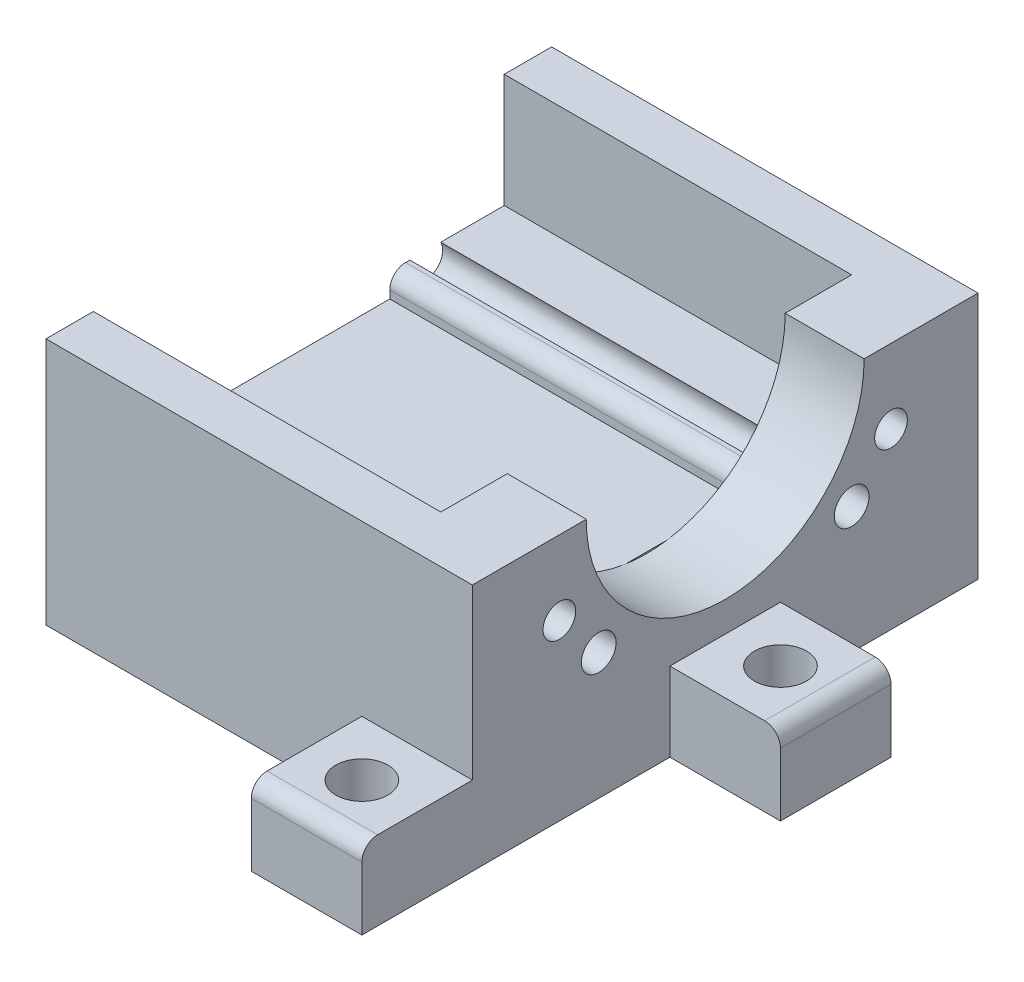
ISO-10303-21;
HEADER;
FILE_DESCRIPTION(('STEP AP214'),'2;1');
FILE_NAME('part.step','',(''),(''),'','','');
FILE_SCHEMA(('AUTOMOTIVE_DESIGN { 1 0 10303 214 1 1 1 1 }'));
ENDSEC;
DATA;
#1=APPLICATION_CONTEXT('core data for automotive mechanical design processes');
#2=APPLICATION_PROTOCOL_DEFINITION('international standard','automotive_design',2000,#1);
#3=PRODUCT_CONTEXT('',#1,'mechanical');
#4=PRODUCT('Part','Part','',(#3));
#5=PRODUCT_RELATED_PRODUCT_CATEGORY('part','',(#4));
#6=PRODUCT_DEFINITION_FORMATION('','',#4);
#7=PRODUCT_DEFINITION_CONTEXT('part definition',#1,'design');
#8=PRODUCT_DEFINITION('design','',#6,#7);
#9=PRODUCT_DEFINITION_SHAPE('','',#8);
#10=(LENGTH_UNIT() NAMED_UNIT(*) SI_UNIT(.MILLI.,.METRE.));
#11=(NAMED_UNIT(*) PLANE_ANGLE_UNIT() SI_UNIT($,.RADIAN.));
#12=(NAMED_UNIT(*) SI_UNIT($,.STERADIAN.) SOLID_ANGLE_UNIT());
#13=UNCERTAINTY_MEASURE_WITH_UNIT(LENGTH_MEASURE(1.E-05),#10,'distance_accuracy_value','');
#14=(GEOMETRIC_REPRESENTATION_CONTEXT(3) GLOBAL_UNCERTAINTY_ASSIGNED_CONTEXT((#13)) GLOBAL_UNIT_ASSIGNED_CONTEXT((#10,
#11,#12)) REPRESENTATION_CONTEXT('',''));
#15=CARTESIAN_POINT('',(0.,0.,0.));
#16=DIRECTION('',(0.,0.,1.));
#17=DIRECTION('',(1.,0.,0.));
#18=AXIS2_PLACEMENT_3D('',#15,#16,#17);
#19=CARTESIAN_POINT('',(11.,8.5,-13.0089));
#20=DIRECTION('',(0.,-1.,0.));
#21=DIRECTION('',(0.,0.,-1.));
#22=AXIS2_PLACEMENT_3D('',#19,#20,#21);
#23=PLANE('',#22);
#24=DIRECTION('',(0.,0.,1.));
#25=VECTOR('',#24,1.);
#26=CARTESIAN_POINT('',(-11.,8.5,-13.0089));
#27=LINE('',#26,#25);
#28=CARTESIAN_POINT('',(-11.,8.5,-13.0089));
#29=VERTEX_POINT('',#28);
#30=CARTESIAN_POINT('',(-11.,8.5,-8.98869589711327));
#31=VERTEX_POINT('',#30);
#32=EDGE_CURVE('E410',#29,#31,#27,.T.);
#33=ORIENTED_EDGE('',*,*,#32,.T.);
#34=DIRECTION('',(1.,0.,0.));
#35=VECTOR('',#34,1.);
#36=CARTESIAN_POINT('',(-11.,8.5,-8.98869589711327));
#37=LINE('',#36,#35);
#38=CARTESIAN_POINT('',(11.,8.5,-8.98869589711327));
#39=VERTEX_POINT('',#38);
#40=EDGE_CURVE('E317',#31,#39,#37,.T.);
#41=ORIENTED_EDGE('',*,*,#40,.T.);
#42=DIRECTION('',(0.,0.,1.));
#43=VECTOR('',#42,1.);
#44=CARTESIAN_POINT('',(11.,8.5,-13.0089));
#45=LINE('',#44,#43);
#46=CARTESIAN_POINT('',(11.,8.5,-13.0089));
#47=VERTEX_POINT('',#46);
#48=EDGE_CURVE('E390',#47,#39,#45,.T.);
#49=ORIENTED_EDGE('',*,*,#48,.F.);
#50=DIRECTION('',(-1.,0.,0.));
#51=VECTOR('',#50,1.);
#52=CARTESIAN_POINT('',(11.,8.5,-13.0089));
#53=LINE('',#52,#51);
#54=EDGE_CURVE('E431',#47,#29,#53,.T.);
#55=ORIENTED_EDGE('',*,*,#54,.T.);
#56=EDGE_LOOP('',(#33,#41,#49,#55));
#57=FACE_BOUND('',#56,.T.);
#58=ADVANCED_FACE('F35',(#57),#23,.F.);
#59=CARTESIAN_POINT('',(11.,8.5,5.7589));
#60=DIRECTION('',(0.,-1.,0.));
#61=DIRECTION('',(0.,0.,-1.));
#62=AXIS2_PLACEMENT_3D('',#59,#60,#61);
#63=PLANE('',#62);
#64=DIRECTION('',(0.,0.,1.));
#65=VECTOR('',#64,1.);
#66=CARTESIAN_POINT('',(11.,8.5,5.7589));
#67=LINE('',#66,#65);
#68=CARTESIAN_POINT('',(11.,8.5,6.7589));
#69=VERTEX_POINT('',#68);
#70=CARTESIAN_POINT('',(11.,8.5,7.02910410288673));
#71=VERTEX_POINT('',#70);
#72=EDGE_CURVE('E405',#69,#71,#67,.T.);
#73=ORIENTED_EDGE('',*,*,#72,.F.);
#74=DIRECTION('',(-1.,0.,0.));
#75=VECTOR('',#74,1.);
#76=CARTESIAN_POINT('',(11.,8.5,6.7589));
#77=LINE('',#76,#75);
#78=CARTESIAN_POINT('',(-11.,8.5,6.7589));
#79=VERTEX_POINT('',#78);
#80=EDGE_CURVE('E448',#69,#79,#77,.T.);
#81=ORIENTED_EDGE('',*,*,#80,.T.);
#82=DIRECTION('',(0.,0.,1.));
#83=VECTOR('',#82,1.);
#84=CARTESIAN_POINT('',(-11.,8.5,5.7589));
#85=LINE('',#84,#83);
#86=CARTESIAN_POINT('',(-11.,8.5,7.02910410288673));
#87=VERTEX_POINT('',#86);
#88=EDGE_CURVE('E421',#79,#87,#85,.T.);
#89=ORIENTED_EDGE('',*,*,#88,.T.);
#90=DIRECTION('',(1.,0.,0.));
#91=VECTOR('',#90,1.);
#92=CARTESIAN_POINT('',(-11.,8.5,7.02910410288673));
#93=LINE('',#92,#91);
#94=EDGE_CURVE('E304',#87,#71,#93,.T.);
#95=ORIENTED_EDGE('',*,*,#94,.T.);
#96=EDGE_LOOP('',(#73,#81,#89,#95));
#97=FACE_BOUND('',#96,.T.);
#98=ADVANCED_FACE('F479',(#97),#63,.F.);
#99=CARTESIAN_POINT('',(11.,0.,0.));
#100=DIRECTION('',(1.,0.,0.));
#101=DIRECTION('',(0.,0.,-1.));
#102=AXIS2_PLACEMENT_3D('',#99,#100,#101);
#103=PLANE('',#102);
#104=CARTESIAN_POINT('',(11.,15.7,0.));
#105=DIRECTION('',(-1.,0.,0.));
#106=DIRECTION('',(0.,0.,-1.));
#107=AXIS2_PLACEMENT_3D('',#104,#105,#106);
#108=CIRCLE('',#107,8.8);
#109=CARTESIAN_POINT('',(11.,7.,-1.32287565553229));
#110=VERTEX_POINT('',#109);
#111=CARTESIAN_POINT('',(11.,7.,1.32287565553229));
#112=VERTEX_POINT('',#111);
#113=EDGE_CURVE('E344',#110,#112,#108,.T.);
#114=ORIENTED_EDGE('',*,*,#113,.F.);
#115=DIRECTION('',(0.,0.,1.));
#116=VECTOR('',#115,1.);
#117=CARTESIAN_POINT('',(11.,7.,-5.7589));
#118=LINE('',#117,#116);
#119=EDGE_CURVE('E401',#110,#112,#118,.T.);
#120=ORIENTED_EDGE('',*,*,#119,.T.);
#121=EDGE_LOOP('',(#114,#120));
#122=FACE_BOUND('',#121,.T.);
#123=ADVANCED_FACE('F560',(#122),#103,.T.);
#124=CARTESIAN_POINT('',(11.,0.,13.0089));
#125=DIRECTION('',(0.,1.,0.));
#126=DIRECTION('',(0.,0.,1.));
#127=AXIS2_PLACEMENT_3D('',#124,#125,#126);
#128=PLANE('',#127);
#129=CARTESIAN_POINT('',(19.5,0.,0.));
#130=DIRECTION('',(0.,1.,0.));
#131=DIRECTION('',(0.,0.,1.));
#132=AXIS2_PLACEMENT_3D('',#129,#130,#131);
#133=CIRCLE('',#132,1.65);
#134=CARTESIAN_POINT('',(19.5,0.,1.65));
#135=VERTEX_POINT('',#134);
#136=EDGE_CURVE('E668',#135,#135,#133,.T.);
#137=ORIENTED_EDGE('',*,*,#136,.T.);
#138=EDGE_LOOP('',(#137));
#139=FACE_BOUND('',#138,.T.);
#140=CARTESIAN_POINT('',(12.5,0.,19.5089));
#141=DIRECTION('',(0.,1.,0.));
#142=DIRECTION('',(0.,0.,1.));
#143=AXIS2_PLACEMENT_3D('',#140,#141,#142);
#144=CIRCLE('',#143,1.65);
#145=CARTESIAN_POINT('',(12.5,0.,21.1589));
#146=VERTEX_POINT('',#145);
#147=EDGE_CURVE('E672',#146,#146,#144,.T.);
#148=ORIENTED_EDGE('',*,*,#147,.T.);
#149=EDGE_LOOP('',(#148));
#150=FACE_BOUND('',#149,.T.);
#151=DIRECTION('',(0.,0.,-1.));
#152=VECTOR('',#151,1.);
#153=CARTESIAN_POINT('',(-11.,0.,13.0089));
#154=LINE('',#153,#152);
#155=CARTESIAN_POINT('',(-11.,0.,16.0089));
#156=VERTEX_POINT('',#155);
#157=CARTESIAN_POINT('',(-11.,0.,-16.0089));
#158=VERTEX_POINT('',#157);
#159=EDGE_CURVE('E384',#156,#158,#154,.T.);
#160=ORIENTED_EDGE('',*,*,#159,.T.);
#161=DIRECTION('',(1.,0.,0.));
#162=VECTOR('',#161,1.);
#163=CARTESIAN_POINT('',(-11.,0.,-16.0089));
#164=LINE('',#163,#162);
#165=CARTESIAN_POINT('',(16.,0.,-16.0089));
#166=VERTEX_POINT('',#165);
#167=EDGE_CURVE('E365',#158,#166,#164,.T.);
#168=ORIENTED_EDGE('',*,*,#167,.T.);
#169=DIRECTION('',(0.,0.,-1.));
#170=VECTOR('',#169,1.);
#171=CARTESIAN_POINT('',(16.,0.,16.0089));
#172=LINE('',#171,#170);
#173=CARTESIAN_POINT('',(16.,0.,-3.5));
#174=VERTEX_POINT('',#173);
#175=EDGE_CURVE('E330',#174,#166,#172,.T.);
#176=ORIENTED_EDGE('',*,*,#175,.F.);
#177=DIRECTION('',(1.,0.,0.));
#178=VECTOR('',#177,1.);
#179=CARTESIAN_POINT('',(16.,0.,-3.5));
#180=LINE('',#179,#178);
#181=CARTESIAN_POINT('',(23.,0.,-3.5));
#182=VERTEX_POINT('',#181);
#183=EDGE_CURVE('E249',#174,#182,#180,.T.);
#184=ORIENTED_EDGE('',*,*,#183,.T.);
#185=DIRECTION('',(0.,0.,1.));
#186=VECTOR('',#185,1.);
#187=CARTESIAN_POINT('',(23.,0.,3.5));
#188=LINE('',#187,#186);
#189=CARTESIAN_POINT('',(23.,0.,3.5));
#190=VERTEX_POINT('',#189);
#191=EDGE_CURVE('E253',#182,#190,#188,.T.);
#192=ORIENTED_EDGE('',*,*,#191,.T.);
#193=DIRECTION('',(-1.,0.,0.));
#194=VECTOR('',#193,1.);
#195=CARTESIAN_POINT('',(16.,0.,3.5));
#196=LINE('',#195,#194);
#197=CARTESIAN_POINT('',(16.,0.,3.5));
#198=VERTEX_POINT('',#197);
#199=EDGE_CURVE('E265',#190,#198,#196,.T.);
#200=ORIENTED_EDGE('',*,*,#199,.T.);
#201=CARTESIAN_POINT('',(16.,0.,23.0089));
#202=VERTEX_POINT('',#201);
#203=EDGE_CURVE('E331',#202,#198,#172,.T.);
#204=ORIENTED_EDGE('',*,*,#203,.F.);
#205=DIRECTION('',(-1.,0.,0.));
#206=VECTOR('',#205,1.);
#207=CARTESIAN_POINT('',(16.,0.,23.0089));
#208=LINE('',#207,#206);
#209=CARTESIAN_POINT('',(9.,0.,23.0089));
#210=VERTEX_POINT('',#209);
#211=EDGE_CURVE('E674',#202,#210,#208,.T.);
#212=ORIENTED_EDGE('',*,*,#211,.T.);
#213=DIRECTION('',(0.,0.,-1.));
#214=VECTOR('',#213,1.);
#215=CARTESIAN_POINT('',(9.,0.,16.0089));
#216=LINE('',#215,#214);
#217=CARTESIAN_POINT('',(9.,0.,16.0089));
#218=VERTEX_POINT('',#217);
#219=EDGE_CURVE('E257',#210,#218,#216,.T.);
#220=ORIENTED_EDGE('',*,*,#219,.T.);
#221=DIRECTION('',(-1.,0.,0.));
#222=VECTOR('',#221,1.);
#223=CARTESIAN_POINT('',(-11.,0.,16.0089));
#224=LINE('',#223,#222);
#225=EDGE_CURVE('E248',#218,#156,#224,.T.);
#226=ORIENTED_EDGE('',*,*,#225,.T.);
#227=EDGE_LOOP('',(#160,#168,#176,#184,#192,#200,#204,#212,#220,#226));
#228=FACE_BOUND('',#227,.T.);
#229=ADVANCED_FACE('F562',(#139,#150,#228),#128,.F.);
#230=CARTESIAN_POINT('',(-11.,8.5,-7.02910410288673));
#231=VERTEX_POINT('',#230);
#232=CARTESIAN_POINT('',(-11.,8.5,-6.7589));
#233=VERTEX_POINT('',#232);
#234=EDGE_CURVE('E409',#231,#233,#27,.T.);
#235=ORIENTED_EDGE('',*,*,#234,.T.);
#236=DIRECTION('',(-1.,0.,0.));
#237=VECTOR('',#236,1.);
#238=CARTESIAN_POINT('',(11.,8.5,-6.7589));
#239=LINE('',#238,#237);
#240=CARTESIAN_POINT('',(11.,8.5,-6.7589));
#241=VERTEX_POINT('',#240);
#242=EDGE_CURVE('E460',#233,#241,#239,.F.);
#243=ORIENTED_EDGE('',*,*,#242,.T.);
#244=CARTESIAN_POINT('',(11.,8.5,-7.02910410288673));
#245=VERTEX_POINT('',#244);
#246=EDGE_CURVE('E394',#245,#241,#45,.T.);
#247=ORIENTED_EDGE('',*,*,#246,.F.);
#248=DIRECTION('',(1.,0.,0.));
#249=VECTOR('',#248,1.);
#250=CARTESIAN_POINT('',(-11.,8.5,-7.02910410288673));
#251=LINE('',#250,#249);
#252=EDGE_CURVE('E314',#245,#231,#251,.F.);
#253=ORIENTED_EDGE('',*,*,#252,.T.);
#254=EDGE_LOOP('',(#235,#243,#247,#253));
#255=FACE_BOUND('',#254,.T.);
#256=ADVANCED_FACE('F510',(#255),#23,.F.);
#257=CARTESIAN_POINT('',(11.,8.5,-5.7589));
#258=DIRECTION('',(0.,0.,-1.));
#259=DIRECTION('',(0.,1.,0.));
#260=AXIS2_PLACEMENT_3D('',#257,#258,#259);
#261=PLANE('',#260);
#262=DIRECTION('',(0.,-1.,0.));
#263=VECTOR('',#262,1.);
#264=CARTESIAN_POINT('',(11.,8.5,-5.7589));
#265=LINE('',#264,#263);
#266=CARTESIAN_POINT('',(11.,7.5,-5.7589));
#267=VERTEX_POINT('',#266);
#268=CARTESIAN_POINT('',(11.,7.,-5.7589));
#269=VERTEX_POINT('',#268);
#270=EDGE_CURVE('E393',#267,#269,#265,.T.);
#271=ORIENTED_EDGE('',*,*,#270,.F.);
#272=DIRECTION('',(-1.,0.,0.));
#273=VECTOR('',#272,1.);
#274=CARTESIAN_POINT('',(11.,7.5,-5.7589));
#275=LINE('',#274,#273);
#276=CARTESIAN_POINT('',(-11.,7.5,-5.7589));
#277=VERTEX_POINT('',#276);
#278=EDGE_CURVE('E457',#267,#277,#275,.T.);
#279=ORIENTED_EDGE('',*,*,#278,.T.);
#280=DIRECTION('',(0.,-1.,0.));
#281=VECTOR('',#280,1.);
#282=CARTESIAN_POINT('',(-11.,8.5,-5.7589));
#283=LINE('',#282,#281);
#284=CARTESIAN_POINT('',(-11.,7.,-5.7589));
#285=VERTEX_POINT('',#284);
#286=EDGE_CURVE('E413',#277,#285,#283,.T.);
#287=ORIENTED_EDGE('',*,*,#286,.T.);
#288=DIRECTION('',(-1.,0.,0.));
#289=VECTOR('',#288,1.);
#290=CARTESIAN_POINT('',(11.,7.,-5.7589));
#291=LINE('',#290,#289);
#292=EDGE_CURVE('E428',#269,#285,#291,.T.);
#293=ORIENTED_EDGE('',*,*,#292,.F.);
#294=EDGE_LOOP('',(#271,#279,#287,#293));
#295=FACE_BOUND('',#294,.T.);
#296=ADVANCED_FACE('F501',(#295),#261,.F.);
#297=CARTESIAN_POINT('',(11.,7.,-5.7589));
#298=DIRECTION('',(0.,-1.,0.));
#299=DIRECTION('',(0.,0.,-1.));
#300=AXIS2_PLACEMENT_3D('',#297,#298,#299);
#301=PLANE('',#300);
#302=DIRECTION('',(0.,0.,1.));
#303=VECTOR('',#302,1.);
#304=CARTESIAN_POINT('',(-11.,7.,-5.7589));
#305=LINE('',#304,#303);
#306=CARTESIAN_POINT('',(-11.,7.,5.7589));
#307=VERTEX_POINT('',#306);
#308=EDGE_CURVE('E415',#285,#307,#305,.T.);
#309=ORIENTED_EDGE('',*,*,#308,.T.);
#310=DIRECTION('',(-1.,0.,0.));
#311=VECTOR('',#310,1.);
#312=CARTESIAN_POINT('',(11.,7.,5.7589));
#313=LINE('',#312,#311);
#314=CARTESIAN_POINT('',(11.,7.,5.7589));
#315=VERTEX_POINT('',#314);
#316=EDGE_CURVE('E425',#315,#307,#313,.T.);
#317=ORIENTED_EDGE('',*,*,#316,.F.);
#318=EDGE_CURVE('E396',#112,#315,#118,.T.);
#319=ORIENTED_EDGE('',*,*,#318,.F.);
#320=ORIENTED_EDGE('',*,*,#119,.F.);
#321=EDGE_CURVE('E397',#269,#110,#118,.T.);
#322=ORIENTED_EDGE('',*,*,#321,.F.);
#323=ORIENTED_EDGE('',*,*,#292,.T.);
#324=EDGE_LOOP('',(#309,#317,#319,#320,#322,#323));
#325=FACE_BOUND('',#324,.T.);
#326=ADVANCED_FACE('F491',(#325),#301,.F.);
#327=CARTESIAN_POINT('',(11.,7.,5.7589));
#328=DIRECTION('',(0.,0.,1.));
#329=DIRECTION('',(0.,-1.,0.));
#330=AXIS2_PLACEMENT_3D('',#327,#328,#329);
#331=PLANE('',#330);
#332=DIRECTION('',(0.,1.,0.));
#333=VECTOR('',#332,1.);
#334=CARTESIAN_POINT('',(-11.,7.,5.7589));
#335=LINE('',#334,#333);
#336=CARTESIAN_POINT('',(-11.,7.5,5.7589));
#337=VERTEX_POINT('',#336);
#338=EDGE_CURVE('E417',#307,#337,#335,.T.);
#339=ORIENTED_EDGE('',*,*,#338,.T.);
#340=DIRECTION('',(-1.,0.,0.));
#341=VECTOR('',#340,1.);
#342=CARTESIAN_POINT('',(11.,7.5,5.7589));
#343=LINE('',#342,#341);
#344=CARTESIAN_POINT('',(11.,7.5,5.7589));
#345=VERTEX_POINT('',#344);
#346=EDGE_CURVE('E455',#337,#345,#343,.F.);
#347=ORIENTED_EDGE('',*,*,#346,.T.);
#348=DIRECTION('',(0.,1.,0.));
#349=VECTOR('',#348,1.);
#350=CARTESIAN_POINT('',(11.,7.,5.7589));
#351=LINE('',#350,#349);
#352=EDGE_CURVE('E400',#315,#345,#351,.T.);
#353=ORIENTED_EDGE('',*,*,#352,.F.);
#354=ORIENTED_EDGE('',*,*,#316,.T.);
#355=EDGE_LOOP('',(#339,#347,#353,#354));
#356=FACE_BOUND('',#355,.T.);
#357=ADVANCED_FACE('F488',(#356),#331,.F.);
#358=CARTESIAN_POINT('',(11.,8.5,8.98869589711327));
#359=VERTEX_POINT('',#358);
#360=CARTESIAN_POINT('',(11.,8.5,13.0089));
#361=VERTEX_POINT('',#360);
#362=EDGE_CURVE('E404',#359,#361,#67,.T.);
#363=ORIENTED_EDGE('',*,*,#362,.F.);
#364=DIRECTION('',(1.,0.,0.));
#365=VECTOR('',#364,1.);
#366=CARTESIAN_POINT('',(-11.,8.5,8.98869589711327));
#367=LINE('',#366,#365);
#368=CARTESIAN_POINT('',(-11.,8.5,8.98869589711327));
#369=VERTEX_POINT('',#368);
#370=EDGE_CURVE('E287',#359,#369,#367,.F.);
#371=ORIENTED_EDGE('',*,*,#370,.T.);
#372=CARTESIAN_POINT('',(-11.,8.5,13.0089));
#373=VERTEX_POINT('',#372);
#374=EDGE_CURVE('E420',#369,#373,#85,.T.);
#375=ORIENTED_EDGE('',*,*,#374,.T.);
#376=DIRECTION('',(-1.,0.,0.));
#377=VECTOR('',#376,1.);
#378=CARTESIAN_POINT('',(11.,8.5,13.0089));
#379=LINE('',#378,#377);
#380=EDGE_CURVE('E407',#361,#373,#379,.T.);
#381=ORIENTED_EDGE('',*,*,#380,.F.);
#382=EDGE_LOOP('',(#363,#371,#375,#381));
#383=FACE_BOUND('',#382,.T.);
#384=ADVANCED_FACE('F555',(#383),#63,.F.);
#385=CARTESIAN_POINT('',(-11.,0.,0.));
#386=DIRECTION('',(1.,0.,0.));
#387=DIRECTION('',(0.,0.,-1.));
#388=AXIS2_PLACEMENT_3D('',#385,#386,#387);
#389=PLANE('',#388);
#390=ORIENTED_EDGE('',*,*,#88,.F.);
#391=CARTESIAN_POINT('',(-11.,7.5,6.7589));
#392=DIRECTION('',(1.,0.,0.));
#393=DIRECTION('',(0.,0.,-1.));
#394=AXIS2_PLACEMENT_3D('',#391,#392,#393);
#395=CIRCLE('',#394,1.);
#396=EDGE_CURVE('E453',#79,#337,#395,.F.);
#397=ORIENTED_EDGE('',*,*,#396,.T.);
#398=ORIENTED_EDGE('',*,*,#338,.F.);
#399=ORIENTED_EDGE('',*,*,#308,.F.);
#400=ORIENTED_EDGE('',*,*,#286,.F.);
#401=CARTESIAN_POINT('',(-11.,7.5,-6.7589));
#402=DIRECTION('',(1.,0.,0.));
#403=DIRECTION('',(0.,0.,-1.));
#404=AXIS2_PLACEMENT_3D('',#401,#402,#403);
#405=CIRCLE('',#404,1.);
#406=EDGE_CURVE('E451',#277,#233,#405,.F.);
#407=ORIENTED_EDGE('',*,*,#406,.T.);
#408=ORIENTED_EDGE('',*,*,#234,.F.);
#409=CARTESIAN_POINT('',(-11.,8.,-8.0089));
#410=DIRECTION('',(1.,0.,0.));
#411=DIRECTION('',(0.,0.,1.));
#412=AXIS2_PLACEMENT_3D('',#409,#410,#411);
#413=CIRCLE('',#412,1.1);
#414=EDGE_CURVE('E289',#231,#31,#413,.T.);
#415=ORIENTED_EDGE('',*,*,#414,.T.);
#416=ORIENTED_EDGE('',*,*,#32,.F.);
#417=DIRECTION('',(0.,-1.,0.));
#418=VECTOR('',#417,1.);
#419=CARTESIAN_POINT('',(-11.,15.7,-13.0089));
#420=LINE('',#419,#418);
#421=CARTESIAN_POINT('',(-11.,15.7,-13.0089));
#422=VERTEX_POINT('',#421);
#423=EDGE_CURVE('E382',#422,#29,#420,.T.);
#424=ORIENTED_EDGE('',*,*,#423,.F.);
#425=DIRECTION('',(0.,0.,-1.));
#426=VECTOR('',#425,1.);
#427=CARTESIAN_POINT('',(-11.,15.7,-13.0089));
#428=LINE('',#427,#426);
#429=CARTESIAN_POINT('',(-11.,15.7,-16.0089));
#430=VERTEX_POINT('',#429);
#431=EDGE_CURVE('E371',#422,#430,#428,.T.);
#432=ORIENTED_EDGE('',*,*,#431,.T.);
#433=DIRECTION('',(0.,-1.,0.));
#434=VECTOR('',#433,1.);
#435=CARTESIAN_POINT('',(-11.,15.7,-16.0089));
#436=LINE('',#435,#434);
#437=EDGE_CURVE('E379',#430,#158,#436,.T.);
#438=ORIENTED_EDGE('',*,*,#437,.T.);
#439=ORIENTED_EDGE('',*,*,#159,.F.);
#440=DIRECTION('',(0.,-1.,0.));
#441=VECTOR('',#440,1.);
#442=CARTESIAN_POINT('',(-11.,15.7,16.0089));
#443=LINE('',#442,#441);
#444=CARTESIAN_POINT('',(-11.,15.7,16.0089));
#445=VERTEX_POINT('',#444);
#446=EDGE_CURVE('E363',#445,#156,#443,.T.);
#447=ORIENTED_EDGE('',*,*,#446,.F.);
#448=DIRECTION('',(0.,0.,-1.));
#449=VECTOR('',#448,1.);
#450=CARTESIAN_POINT('',(-11.,15.7,13.0089));
#451=LINE('',#450,#449);
#452=CARTESIAN_POINT('',(-11.,15.7,13.0089));
#453=VERTEX_POINT('',#452);
#454=EDGE_CURVE('E353',#445,#453,#451,.T.);
#455=ORIENTED_EDGE('',*,*,#454,.T.);
#456=DIRECTION('',(0.,-1.,0.));
#457=VECTOR('',#456,1.);
#458=CARTESIAN_POINT('',(-11.,15.7,13.0089));
#459=LINE('',#458,#457);
#460=EDGE_CURVE('E361',#453,#373,#459,.T.);
#461=ORIENTED_EDGE('',*,*,#460,.T.);
#462=ORIENTED_EDGE('',*,*,#374,.F.);
#463=CARTESIAN_POINT('',(-11.,8.,8.0089));
#464=DIRECTION('',(1.,0.,0.));
#465=DIRECTION('',(0.,0.,-1.));
#466=AXIS2_PLACEMENT_3D('',#463,#464,#465);
#467=CIRCLE('',#466,1.1);
#468=EDGE_CURVE('E297',#369,#87,#467,.T.);
#469=ORIENTED_EDGE('',*,*,#468,.T.);
#470=EDGE_LOOP('',(#390,#397,#398,#399,#400,#407,#408,#415,#416,#424,#432,#438,#439,#447,#455,
#461,#462,#469));
#471=FACE_BOUND('',#470,.T.);
#472=ADVANCED_FACE('F485',(#471),#389,.F.);
#473=CARTESIAN_POINT('',(-11.,15.7,-13.0089));
#474=DIRECTION('',(0.,0.,1.));
#475=DIRECTION('',(1.,0.,0.));
#476=AXIS2_PLACEMENT_3D('',#473,#474,#475);
#477=PLANE('',#476);
#478=ORIENTED_EDGE('',*,*,#54,.F.);
#479=DIRECTION('',(0.,-1.,0.));
#480=VECTOR('',#479,1.);
#481=CARTESIAN_POINT('',(11.,15.7,-13.0089));
#482=LINE('',#481,#480);
#483=CARTESIAN_POINT('',(11.,15.7,-13.0089));
#484=VERTEX_POINT('',#483);
#485=EDGE_CURVE('E385',#484,#47,#482,.T.);
#486=ORIENTED_EDGE('',*,*,#485,.F.);
#487=DIRECTION('',(-1.,0.,0.));
#488=VECTOR('',#487,1.);
#489=CARTESIAN_POINT('',(-11.,15.7,-13.0089));
#490=LINE('',#489,#488);
#491=EDGE_CURVE('E376',#484,#422,#490,.T.);
#492=ORIENTED_EDGE('',*,*,#491,.T.);
#493=ORIENTED_EDGE('',*,*,#423,.T.);
#494=EDGE_LOOP('',(#478,#486,#492,#493));
#495=FACE_BOUND('',#494,.T.);
#496=ADVANCED_FACE('F526',(#495),#477,.T.);
#497=CARTESIAN_POINT('',(-11.,15.7,-16.0089));
#498=DIRECTION('',(0.,0.,-1.));
#499=DIRECTION('',(-1.,0.,0.));
#500=AXIS2_PLACEMENT_3D('',#497,#498,#499);
#501=PLANE('',#500);
#502=ORIENTED_EDGE('',*,*,#167,.F.);
#503=ORIENTED_EDGE('',*,*,#437,.F.);
#504=DIRECTION('',(1.,0.,0.));
#505=VECTOR('',#504,1.);
#506=CARTESIAN_POINT('',(-11.,15.7,-16.0089));
#507=LINE('',#506,#505);
#508=CARTESIAN_POINT('',(16.,15.7,-16.0089));
#509=VERTEX_POINT('',#508);
#510=EDGE_CURVE('E374',#430,#509,#507,.T.);
#511=ORIENTED_EDGE('',*,*,#510,.T.);
#512=DIRECTION('',(0.,1.,0.));
#513=VECTOR('',#512,1.);
#514=CARTESIAN_POINT('',(16.,0.,-16.0089));
#515=LINE('',#514,#513);
#516=EDGE_CURVE('E334',#166,#509,#515,.T.);
#517=ORIENTED_EDGE('',*,*,#516,.F.);
#518=EDGE_LOOP('',(#502,#503,#511,#517));
#519=FACE_BOUND('',#518,.T.);
#520=ADVANCED_FACE('F541',(#519),#501,.T.);
#521=CARTESIAN_POINT('',(0.,15.7,0.));
#522=DIRECTION('',(0.,-1.,0.));
#523=DIRECTION('',(0.,0.,-1.));
#524=AXIS2_PLACEMENT_3D('',#521,#522,#523);
#525=PLANE('',#524);
#526=ORIENTED_EDGE('',*,*,#431,.F.);
#527=ORIENTED_EDGE('',*,*,#491,.F.);
#528=DIRECTION('',(0.,0.,1.));
#529=VECTOR('',#528,1.);
#530=CARTESIAN_POINT('',(11.,15.7,-16.0089));
#531=LINE('',#530,#529);
#532=CARTESIAN_POINT('',(11.,15.7,-8.8));
#533=VERTEX_POINT('',#532);
#534=EDGE_CURVE('E325',#484,#533,#531,.T.);
#535=ORIENTED_EDGE('',*,*,#534,.T.);
#536=DIRECTION('',(-1.,0.,0.));
#537=VECTOR('',#536,1.);
#538=CARTESIAN_POINT('',(16.,15.7,-8.8));
#539=LINE('',#538,#537);
#540=CARTESIAN_POINT('',(16.,15.7,-8.8));
#541=VERTEX_POINT('',#540);
#542=EDGE_CURVE('E339',#541,#533,#539,.T.);
#543=ORIENTED_EDGE('',*,*,#542,.F.);
#544=DIRECTION('',(0.,0.,1.));
#545=VECTOR('',#544,1.);
#546=CARTESIAN_POINT('',(16.,15.7,-16.0089));
#547=LINE('',#546,#545);
#548=EDGE_CURVE('E337',#509,#541,#547,.T.);
#549=ORIENTED_EDGE('',*,*,#548,.F.);
#550=ORIENTED_EDGE('',*,*,#510,.F.);
#551=EDGE_LOOP('',(#526,#527,#535,#543,#549,#550));
#552=FACE_BOUND('',#551,.T.);
#553=ADVANCED_FACE('F523',(#552),#525,.F.);
#554=CARTESIAN_POINT('',(-11.,15.7,16.0089));
#555=DIRECTION('',(0.,0.,1.));
#556=DIRECTION('',(1.,0.,0.));
#557=AXIS2_PLACEMENT_3D('',#554,#555,#556);
#558=PLANE('',#557);
#559=DIRECTION('',(0.,-1.,0.));
#560=VECTOR('',#559,1.);
#561=CARTESIAN_POINT('',(9.,5.,16.0089));
#562=LINE('',#561,#560);
#563=CARTESIAN_POINT('',(9.,5.,16.0089));
#564=VERTEX_POINT('',#563);
#565=EDGE_CURVE('E233',#564,#218,#562,.T.);
#566=ORIENTED_EDGE('',*,*,#565,.F.);
#567=DIRECTION('',(1.,0.,0.));
#568=VECTOR('',#567,1.);
#569=CARTESIAN_POINT('',(16.,5.,16.0089));
#570=LINE('',#569,#568);
#571=CARTESIAN_POINT('',(16.,5.,16.0089));
#572=VERTEX_POINT('',#571);
#573=EDGE_CURVE('E235',#564,#572,#570,.T.);
#574=ORIENTED_EDGE('',*,*,#573,.T.);
#575=DIRECTION('',(0.,-1.,0.));
#576=VECTOR('',#575,1.);
#577=CARTESIAN_POINT('',(16.,15.7,16.0089));
#578=LINE('',#577,#576);
#579=CARTESIAN_POINT('',(16.,15.7,16.0089));
#580=VERTEX_POINT('',#579);
#581=EDGE_CURVE('E328',#580,#572,#578,.T.);
#582=ORIENTED_EDGE('',*,*,#581,.F.);
#583=DIRECTION('',(-1.,0.,0.));
#584=VECTOR('',#583,1.);
#585=CARTESIAN_POINT('',(-11.,15.7,16.0089));
#586=LINE('',#585,#584);
#587=EDGE_CURVE('E358',#580,#445,#586,.T.);
#588=ORIENTED_EDGE('',*,*,#587,.T.);
#589=ORIENTED_EDGE('',*,*,#446,.T.);
#590=ORIENTED_EDGE('',*,*,#225,.F.);
#591=EDGE_LOOP('',(#566,#574,#582,#588,#589,#590));
#592=FACE_BOUND('',#591,.T.);
#593=ADVANCED_FACE('F246',(#592),#558,.T.);
#594=CARTESIAN_POINT('',(-11.,15.7,13.0089));
#595=DIRECTION('',(0.,0.,-1.));
#596=DIRECTION('',(-1.,0.,0.));
#597=AXIS2_PLACEMENT_3D('',#594,#595,#596);
#598=PLANE('',#597);
#599=DIRECTION('',(0.,-1.,0.));
#600=VECTOR('',#599,1.);
#601=CARTESIAN_POINT('',(11.,15.7,13.0089));
#602=LINE('',#601,#600);
#603=CARTESIAN_POINT('',(11.,15.7,13.0089));
#604=VERTEX_POINT('',#603);
#605=EDGE_CURVE('E366',#604,#361,#602,.T.);
#606=ORIENTED_EDGE('',*,*,#605,.T.);
#607=ORIENTED_EDGE('',*,*,#380,.T.);
#608=ORIENTED_EDGE('',*,*,#460,.F.);
#609=DIRECTION('',(1.,0.,0.));
#610=VECTOR('',#609,1.);
#611=CARTESIAN_POINT('',(-11.,15.7,13.0089));
#612=LINE('',#611,#610);
#613=EDGE_CURVE('E356',#453,#604,#612,.T.);
#614=ORIENTED_EDGE('',*,*,#613,.T.);
#615=EDGE_LOOP('',(#606,#607,#608,#614));
#616=FACE_BOUND('',#615,.T.);
#617=ADVANCED_FACE('F550',(#616),#598,.T.);
#618=CARTESIAN_POINT('',(0.,15.7,0.));
#619=DIRECTION('',(0.,1.,0.));
#620=DIRECTION('',(0.,0.,1.));
#621=AXIS2_PLACEMENT_3D('',#618,#619,#620);
#622=PLANE('',#621);
#623=ORIENTED_EDGE('',*,*,#454,.F.);
#624=ORIENTED_EDGE('',*,*,#587,.F.);
#625=DIRECTION('',(0.,0.,1.));
#626=VECTOR('',#625,1.);
#627=CARTESIAN_POINT('',(16.,15.7,8.8));
#628=LINE('',#627,#626);
#629=CARTESIAN_POINT('',(16.,15.7,8.8));
#630=VERTEX_POINT('',#629);
#631=EDGE_CURVE('E324',#630,#580,#628,.T.);
#632=ORIENTED_EDGE('',*,*,#631,.F.);
#633=DIRECTION('',(-1.,0.,0.));
#634=VECTOR('',#633,1.);
#635=CARTESIAN_POINT('',(16.,15.7,8.8));
#636=LINE('',#635,#634);
#637=CARTESIAN_POINT('',(11.,15.7,8.8));
#638=VERTEX_POINT('',#637);
#639=EDGE_CURVE('E350',#630,#638,#636,.T.);
#640=ORIENTED_EDGE('',*,*,#639,.T.);
#641=DIRECTION('',(0.,0.,1.));
#642=VECTOR('',#641,1.);
#643=CARTESIAN_POINT('',(11.,15.7,8.8));
#644=LINE('',#643,#642);
#645=EDGE_CURVE('E343',#638,#604,#644,.T.);
#646=ORIENTED_EDGE('',*,*,#645,.T.);
#647=ORIENTED_EDGE('',*,*,#613,.F.);
#648=EDGE_LOOP('',(#623,#624,#632,#640,#646,#647));
#649=FACE_BOUND('',#648,.T.);
#650=ADVANCED_FACE('F546',(#649),#622,.T.);
#651=CARTESIAN_POINT('',(11.,15.7,0.));
#652=DIRECTION('',(1.,0.,0.));
#653=DIRECTION('',(0.,0.,-1.));
#654=AXIS2_PLACEMENT_3D('',#651,#652,#653);
#655=PLANE('',#654);
#656=CARTESIAN_POINT('',(11.,11.,-10.5));
#657=DIRECTION('',(1.,0.,0.));
#658=DIRECTION('',(0.,0.,-1.));
#659=AXIS2_PLACEMENT_3D('',#656,#657,#658);
#660=CIRCLE('',#659,1.035);
#661=CARTESIAN_POINT('',(11.,11.,-11.535));
#662=VERTEX_POINT('',#661);
#663=EDGE_CURVE('E308',#662,#662,#660,.T.);
#664=ORIENTED_EDGE('',*,*,#663,.T.);
#665=EDGE_LOOP('',(#664));
#666=FACE_BOUND('',#665,.T.);
#667=ORIENTED_EDGE('',*,*,#48,.T.);
#668=CARTESIAN_POINT('',(11.,8.,-8.0089));
#669=DIRECTION('',(1.,0.,0.));
#670=DIRECTION('',(0.,0.,-1.));
#671=AXIS2_PLACEMENT_3D('',#668,#669,#670);
#672=CIRCLE('',#671,1.1);
#673=EDGE_CURVE('E311',#39,#245,#672,.T.);
#674=ORIENTED_EDGE('',*,*,#673,.T.);
#675=ORIENTED_EDGE('',*,*,#246,.T.);
#676=CARTESIAN_POINT('',(11.,7.5,-6.7589));
#677=DIRECTION('',(1.,0.,0.));
#678=DIRECTION('',(0.,0.,-1.));
#679=AXIS2_PLACEMENT_3D('',#676,#677,#678);
#680=CIRCLE('',#679,1.);
#681=EDGE_CURVE('E11',#241,#267,#680,.T.);
#682=ORIENTED_EDGE('',*,*,#681,.T.);
#683=ORIENTED_EDGE('',*,*,#270,.T.);
#684=ORIENTED_EDGE('',*,*,#321,.T.);
#685=EDGE_CURVE('E340',#533,#110,#108,.T.);
#686=ORIENTED_EDGE('',*,*,#685,.F.);
#687=ORIENTED_EDGE('',*,*,#534,.F.);
#688=ORIENTED_EDGE('',*,*,#485,.T.);
#689=EDGE_LOOP('',(#667,#674,#675,#682,#683,#684,#686,#687,#688));
#690=FACE_BOUND('',#689,.T.);
#691=ADVANCED_FACE('F512',(#666,#690),#655,.F.);
#692=CARTESIAN_POINT('',(16.,15.7,0.));
#693=DIRECTION('',(-1.,0.,0.));
#694=DIRECTION('',(0.,0.,1.));
#695=AXIS2_PLACEMENT_3D('',#692,#693,#694);
#696=CYLINDRICAL_SURFACE('',#695,8.8);
#697=ORIENTED_EDGE('',*,*,#685,.T.);
#698=ORIENTED_EDGE('',*,*,#113,.T.);
#699=EDGE_CURVE('E320',#112,#638,#108,.T.);
#700=ORIENTED_EDGE('',*,*,#699,.T.);
#701=ORIENTED_EDGE('',*,*,#639,.F.);
#702=CARTESIAN_POINT('',(16.,15.7,0.));
#703=DIRECTION('',(-1.,0.,0.));
#704=DIRECTION('',(0.,0.,-1.));
#705=AXIS2_PLACEMENT_3D('',#702,#703,#704);
#706=CIRCLE('',#705,8.8);
#707=EDGE_CURVE('E321',#541,#630,#706,.T.);
#708=ORIENTED_EDGE('',*,*,#707,.F.);
#709=ORIENTED_EDGE('',*,*,#542,.T.);
#710=EDGE_LOOP('',(#697,#698,#700,#701,#708,#709));
#711=FACE_BOUND('',#710,.T.);
#712=ADVANCED_FACE('F531',(#711),#696,.F.);
#713=CARTESIAN_POINT('',(16.,15.7,0.));
#714=DIRECTION('',(1.,0.,0.));
#715=DIRECTION('',(0.,0.,-1.));
#716=AXIS2_PLACEMENT_3D('',#713,#714,#715);
#717=PLANE('',#716);
#718=DIRECTION('',(0.,0.,1.));
#719=VECTOR('',#718,1.);
#720=CARTESIAN_POINT('',(16.,5.,16.0089));
#721=LINE('',#720,#719);
#722=CARTESIAN_POINT('',(16.,5.,22.0089));
#723=VERTEX_POINT('',#722);
#724=EDGE_CURVE('E236',#572,#723,#721,.T.);
#725=ORIENTED_EDGE('',*,*,#724,.T.);
#726=CARTESIAN_POINT('',(16.,4.,22.0089));
#727=DIRECTION('',(1.,0.,0.));
#728=DIRECTION('',(0.,0.,-1.));
#729=AXIS2_PLACEMENT_3D('',#726,#727,#728);
#730=CIRCLE('',#729,1.);
#731=CARTESIAN_POINT('',(16.,4.,23.0089));
#732=VERTEX_POINT('',#731);
#733=EDGE_CURVE('E467',#723,#732,#730,.T.);
#734=ORIENTED_EDGE('',*,*,#733,.T.);
#735=DIRECTION('',(0.,-1.,0.));
#736=VECTOR('',#735,1.);
#737=CARTESIAN_POINT('',(16.,5.,23.0089));
#738=LINE('',#737,#736);
#739=EDGE_CURVE('E243',#732,#202,#738,.T.);
#740=ORIENTED_EDGE('',*,*,#739,.T.);
#741=ORIENTED_EDGE('',*,*,#203,.T.);
#742=DIRECTION('',(0.,-1.,0.));
#743=VECTOR('',#742,1.);
#744=CARTESIAN_POINT('',(16.,5.,3.5));
#745=LINE('',#744,#743);
#746=CARTESIAN_POINT('',(16.,5.,3.5));
#747=VERTEX_POINT('',#746);
#748=EDGE_CURVE('E275',#747,#198,#745,.T.);
#749=ORIENTED_EDGE('',*,*,#748,.F.);
#750=DIRECTION('',(0.,0.,-1.));
#751=VECTOR('',#750,1.);
#752=CARTESIAN_POINT('',(16.,5.,3.5));
#753=LINE('',#752,#751);
#754=CARTESIAN_POINT('',(16.,5.,-3.5));
#755=VERTEX_POINT('',#754);
#756=EDGE_CURVE('E261',#747,#755,#753,.T.);
#757=ORIENTED_EDGE('',*,*,#756,.T.);
#758=DIRECTION('',(0.,-1.,0.));
#759=VECTOR('',#758,1.);
#760=CARTESIAN_POINT('',(16.,5.,-3.5));
#761=LINE('',#760,#759);
#762=EDGE_CURVE('E269',#755,#174,#761,.T.);
#763=ORIENTED_EDGE('',*,*,#762,.T.);
#764=ORIENTED_EDGE('',*,*,#175,.T.);
#765=ORIENTED_EDGE('',*,*,#516,.T.);
#766=ORIENTED_EDGE('',*,*,#548,.T.);
#767=ORIENTED_EDGE('',*,*,#707,.T.);
#768=ORIENTED_EDGE('',*,*,#631,.T.);
#769=ORIENTED_EDGE('',*,*,#581,.T.);
#770=EDGE_LOOP('',(#725,#734,#740,#741,#749,#757,#763,#764,#765,#766,#767,#768,#769));
#771=FACE_BOUND('',#770,.T.);
#772=CARTESIAN_POINT('',(16.,11.,10.5));
#773=DIRECTION('',(1.,0.,0.));
#774=DIRECTION('',(0.,0.,-1.));
#775=AXIS2_PLACEMENT_3D('',#772,#773,#774);
#776=CIRCLE('',#775,1.035);
#777=CARTESIAN_POINT('',(16.,11.,9.465));
#778=VERTEX_POINT('',#777);
#779=EDGE_CURVE('E284',#778,#778,#776,.T.);
#780=ORIENTED_EDGE('',*,*,#779,.F.);
#781=EDGE_LOOP('',(#780));
#782=FACE_BOUND('',#781,.T.);
#783=CARTESIAN_POINT('',(16.,8.,-8.0089));
#784=DIRECTION('',(1.,0.,0.));
#785=DIRECTION('',(0.,0.,1.));
#786=AXIS2_PLACEMENT_3D('',#783,#784,#785);
#787=CIRCLE('',#786,1.1);
#788=CARTESIAN_POINT('',(16.,8.,-6.9089));
#789=VERTEX_POINT('',#788);
#790=EDGE_CURVE('E277',#789,#789,#787,.T.);
#791=ORIENTED_EDGE('',*,*,#790,.F.);
#792=EDGE_LOOP('',(#791));
#793=FACE_BOUND('',#792,.T.);
#794=CARTESIAN_POINT('',(16.,8.,8.0089));
#795=DIRECTION('',(1.,0.,0.));
#796=DIRECTION('',(0.,0.,-1.));
#797=AXIS2_PLACEMENT_3D('',#794,#795,#796);
#798=CIRCLE('',#797,1.1);
#799=CARTESIAN_POINT('',(16.,8.,6.9089));
#800=VERTEX_POINT('',#799);
#801=EDGE_CURVE('E292',#800,#800,#798,.T.);
#802=ORIENTED_EDGE('',*,*,#801,.F.);
#803=EDGE_LOOP('',(#802));
#804=FACE_BOUND('',#803,.T.);
#805=CARTESIAN_POINT('',(16.,11.,-10.5));
#806=DIRECTION('',(1.,0.,0.));
#807=DIRECTION('',(0.,0.,1.));
#808=AXIS2_PLACEMENT_3D('',#805,#806,#807);
#809=CIRCLE('',#808,1.035);
#810=CARTESIAN_POINT('',(16.,11.,-9.465));
#811=VERTEX_POINT('',#810);
#812=EDGE_CURVE('E288',#811,#811,#809,.T.);
#813=ORIENTED_EDGE('',*,*,#812,.F.);
#814=EDGE_LOOP('',(#813));
#815=FACE_BOUND('',#814,.T.);
#816=ADVANCED_FACE('F535',(#771,#782,#793,#804,#815),#717,.T.);
#817=CARTESIAN_POINT('',(11.,11.,10.5));
#818=DIRECTION('',(1.,0.,0.));
#819=DIRECTION('',(0.,0.,-1.));
#820=AXIS2_PLACEMENT_3D('',#817,#818,#819);
#821=CIRCLE('',#820,1.035);
#822=CARTESIAN_POINT('',(11.,11.,9.465));
#823=VERTEX_POINT('',#822);
#824=EDGE_CURVE('E307',#823,#823,#821,.T.);
#825=ORIENTED_EDGE('',*,*,#824,.T.);
#826=EDGE_LOOP('',(#825));
#827=FACE_BOUND('',#826,.T.);
#828=ORIENTED_EDGE('',*,*,#352,.T.);
#829=CARTESIAN_POINT('',(11.,7.5,6.7589));
#830=DIRECTION('',(1.,0.,0.));
#831=DIRECTION('',(0.,0.,-1.));
#832=AXIS2_PLACEMENT_3D('',#829,#830,#831);
#833=CIRCLE('',#832,1.);
#834=EDGE_CURVE('E43',#345,#69,#833,.T.);
#835=ORIENTED_EDGE('',*,*,#834,.T.);
#836=ORIENTED_EDGE('',*,*,#72,.T.);
#837=CARTESIAN_POINT('',(11.,8.,8.0089));
#838=DIRECTION('',(1.,0.,0.));
#839=DIRECTION('',(0.,0.,-1.));
#840=AXIS2_PLACEMENT_3D('',#837,#838,#839);
#841=CIRCLE('',#840,1.1);
#842=EDGE_CURVE('E434',#71,#359,#841,.T.);
#843=ORIENTED_EDGE('',*,*,#842,.T.);
#844=ORIENTED_EDGE('',*,*,#362,.T.);
#845=ORIENTED_EDGE('',*,*,#605,.F.);
#846=ORIENTED_EDGE('',*,*,#645,.F.);
#847=ORIENTED_EDGE('',*,*,#699,.F.);
#848=ORIENTED_EDGE('',*,*,#318,.T.);
#849=EDGE_LOOP('',(#828,#835,#836,#843,#844,#845,#846,#847,#848));
#850=FACE_BOUND('',#849,.T.);
#851=ADVANCED_FACE('F471',(#827,#850),#655,.F.);
#852=CARTESIAN_POINT('',(-11.,8.,8.0089));
#853=DIRECTION('',(1.,0.,0.));
#854=DIRECTION('',(0.,0.,-1.));
#855=AXIS2_PLACEMENT_3D('',#852,#853,#854);
#856=CYLINDRICAL_SURFACE('',#855,1.1);
#857=ORIENTED_EDGE('',*,*,#801,.T.);
#858=EDGE_LOOP('',(#857));
#859=FACE_BOUND('',#858,.T.);
#860=ORIENTED_EDGE('',*,*,#468,.F.);
#861=ORIENTED_EDGE('',*,*,#370,.F.);
#862=ORIENTED_EDGE('',*,*,#842,.F.);
#863=ORIENTED_EDGE('',*,*,#94,.F.);
#864=EDGE_LOOP('',(#860,#861,#862,#863));
#865=FACE_BOUND('',#864,.T.);
#866=ADVANCED_FACE('F557',(#859,#865),#856,.F.);
#867=CARTESIAN_POINT('',(-11.,11.,10.5));
#868=DIRECTION('',(1.,0.,0.));
#869=DIRECTION('',(0.,0.,-1.));
#870=AXIS2_PLACEMENT_3D('',#867,#868,#869);
#871=CYLINDRICAL_SURFACE('',#870,1.035);
#872=ORIENTED_EDGE('',*,*,#779,.T.);
#873=EDGE_LOOP('',(#872));
#874=FACE_BOUND('',#873,.T.);
#875=ORIENTED_EDGE('',*,*,#824,.F.);
#876=EDGE_LOOP('',(#875));
#877=FACE_BOUND('',#876,.T.);
#878=ADVANCED_FACE('F615',(#874,#877),#871,.F.);
#879=CARTESIAN_POINT('',(-11.,11.,-10.5));
#880=DIRECTION('',(1.,0.,0.));
#881=DIRECTION('',(0.,0.,-1.));
#882=AXIS2_PLACEMENT_3D('',#879,#880,#881);
#883=CYLINDRICAL_SURFACE('',#882,1.035);
#884=ORIENTED_EDGE('',*,*,#812,.T.);
#885=EDGE_LOOP('',(#884));
#886=FACE_BOUND('',#885,.T.);
#887=ORIENTED_EDGE('',*,*,#663,.F.);
#888=EDGE_LOOP('',(#887));
#889=FACE_BOUND('',#888,.T.);
#890=ADVANCED_FACE('F617',(#886,#889),#883,.F.);
#891=CARTESIAN_POINT('',(-11.,8.,-8.0089));
#892=DIRECTION('',(1.,0.,0.));
#893=DIRECTION('',(0.,0.,-1.));
#894=AXIS2_PLACEMENT_3D('',#891,#892,#893);
#895=CYLINDRICAL_SURFACE('',#894,1.1);
#896=ORIENTED_EDGE('',*,*,#790,.T.);
#897=EDGE_LOOP('',(#896));
#898=FACE_BOUND('',#897,.T.);
#899=ORIENTED_EDGE('',*,*,#414,.F.);
#900=ORIENTED_EDGE('',*,*,#252,.F.);
#901=ORIENTED_EDGE('',*,*,#673,.F.);
#902=ORIENTED_EDGE('',*,*,#40,.F.);
#903=EDGE_LOOP('',(#899,#900,#901,#902));
#904=FACE_BOUND('',#903,.T.);
#905=ADVANCED_FACE('F515',(#898,#904),#895,.F.);
#906=CARTESIAN_POINT('',(16.,5.,3.5));
#907=DIRECTION('',(0.,0.,1.));
#908=DIRECTION('',(1.,0.,0.));
#909=AXIS2_PLACEMENT_3D('',#906,#907,#908);
#910=PLANE('',#909);
#911=DIRECTION('',(0.,-1.,0.));
#912=VECTOR('',#911,1.);
#913=CARTESIAN_POINT('',(23.,5.,3.5));
#914=LINE('',#913,#912);
#915=CARTESIAN_POINT('',(23.,4.,3.5));
#916=VERTEX_POINT('',#915);
#917=EDGE_CURVE('E278',#916,#190,#914,.T.);
#918=ORIENTED_EDGE('',*,*,#917,.F.);
#919=CARTESIAN_POINT('',(22.,4.,3.5));
#920=DIRECTION('',(0.,0.,1.));
#921=DIRECTION('',(1.,0.,0.));
#922=AXIS2_PLACEMENT_3D('',#919,#920,#921);
#923=CIRCLE('',#922,1.);
#924=CARTESIAN_POINT('',(22.,5.,3.5));
#925=VERTEX_POINT('',#924);
#926=EDGE_CURVE('E442',#916,#925,#923,.T.);
#927=ORIENTED_EDGE('',*,*,#926,.T.);
#928=DIRECTION('',(-1.,0.,0.));
#929=VECTOR('',#928,1.);
#930=CARTESIAN_POINT('',(16.,5.,3.5));
#931=LINE('',#930,#929);
#932=EDGE_CURVE('E268',#925,#747,#931,.T.);
#933=ORIENTED_EDGE('',*,*,#932,.T.);
#934=ORIENTED_EDGE('',*,*,#748,.T.);
#935=ORIENTED_EDGE('',*,*,#199,.F.);
#936=EDGE_LOOP('',(#918,#927,#933,#934,#935));
#937=FACE_BOUND('',#936,.T.);
#938=ADVANCED_FACE('F623',(#937),#910,.T.);
#939=CARTESIAN_POINT('',(23.,5.,3.5));
#940=DIRECTION('',(1.,0.,0.));
#941=DIRECTION('',(0.,0.,-1.));
#942=AXIS2_PLACEMENT_3D('',#939,#940,#941);
#943=PLANE('',#942);
#944=DIRECTION('',(0.,-1.,0.));
#945=VECTOR('',#944,1.);
#946=CARTESIAN_POINT('',(23.,5.,-3.5));
#947=LINE('',#946,#945);
#948=CARTESIAN_POINT('',(23.,4.,-3.5));
#949=VERTEX_POINT('',#948);
#950=EDGE_CURVE('E280',#949,#182,#947,.T.);
#951=ORIENTED_EDGE('',*,*,#950,.F.);
#952=DIRECTION('',(0.,0.,1.));
#953=VECTOR('',#952,1.);
#954=CARTESIAN_POINT('',(23.,4.,3.5));
#955=LINE('',#954,#953);
#956=EDGE_CURVE('E437',#949,#916,#955,.T.);
#957=ORIENTED_EDGE('',*,*,#956,.T.);
#958=ORIENTED_EDGE('',*,*,#917,.T.);
#959=ORIENTED_EDGE('',*,*,#191,.F.);
#960=EDGE_LOOP('',(#951,#957,#958,#959));
#961=FACE_BOUND('',#960,.T.);
#962=ADVANCED_FACE('F632',(#961),#943,.T.);
#963=CARTESIAN_POINT('',(16.,5.,-3.5));
#964=DIRECTION('',(0.,0.,-1.));
#965=DIRECTION('',(-1.,0.,0.));
#966=AXIS2_PLACEMENT_3D('',#963,#964,#965);
#967=PLANE('',#966);
#968=DIRECTION('',(1.,0.,0.));
#969=VECTOR('',#968,1.);
#970=CARTESIAN_POINT('',(16.,5.,-3.5));
#971=LINE('',#970,#969);
#972=CARTESIAN_POINT('',(22.,5.,-3.5));
#973=VERTEX_POINT('',#972);
#974=EDGE_CURVE('E264',#755,#973,#971,.T.);
#975=ORIENTED_EDGE('',*,*,#974,.T.);
#976=CARTESIAN_POINT('',(22.,4.,-3.5));
#977=DIRECTION('',(0.,0.,-1.));
#978=DIRECTION('',(-1.,0.,0.));
#979=AXIS2_PLACEMENT_3D('',#976,#977,#978);
#980=CIRCLE('',#979,1.);
#981=EDGE_CURVE('E446',#973,#949,#980,.T.);
#982=ORIENTED_EDGE('',*,*,#981,.T.);
#983=ORIENTED_EDGE('',*,*,#950,.T.);
#984=ORIENTED_EDGE('',*,*,#183,.F.);
#985=ORIENTED_EDGE('',*,*,#762,.F.);
#986=EDGE_LOOP('',(#975,#982,#983,#984,#985));
#987=FACE_BOUND('',#986,.T.);
#988=ADVANCED_FACE('F628',(#987),#967,.T.);
#989=CARTESIAN_POINT('',(0.,5.,0.));
#990=DIRECTION('',(0.,-1.,0.));
#991=DIRECTION('',(0.,0.,-1.));
#992=AXIS2_PLACEMENT_3D('',#989,#990,#991);
#993=PLANE('',#992);
#994=CARTESIAN_POINT('',(19.5,5.,0.));
#995=DIRECTION('',(0.,1.,0.));
#996=DIRECTION('',(0.,0.,1.));
#997=AXIS2_PLACEMENT_3D('',#994,#995,#996);
#998=CIRCLE('',#997,1.65);
#999=CARTESIAN_POINT('',(19.5,5.,1.65));
#1000=VERTEX_POINT('',#999);
#1001=EDGE_CURVE('E671',#1000,#1000,#998,.T.);
#1002=ORIENTED_EDGE('',*,*,#1001,.F.);
#1003=EDGE_LOOP('',(#1002));
#1004=FACE_BOUND('',#1003,.T.);
#1005=ORIENTED_EDGE('',*,*,#932,.F.);
#1006=DIRECTION('',(0.,0.,1.));
#1007=VECTOR('',#1006,1.);
#1008=CARTESIAN_POINT('',(22.,5.,-3.5));
#1009=LINE('',#1008,#1007);
#1010=EDGE_CURVE('E444',#925,#973,#1009,.F.);
#1011=ORIENTED_EDGE('',*,*,#1010,.T.);
#1012=ORIENTED_EDGE('',*,*,#974,.F.);
#1013=ORIENTED_EDGE('',*,*,#756,.F.);
#1014=EDGE_LOOP('',(#1005,#1011,#1012,#1013));
#1015=FACE_BOUND('',#1014,.T.);
#1016=ADVANCED_FACE('F631',(#1004,#1015),#993,.F.);
#1017=CARTESIAN_POINT('',(9.,5.,16.0089));
#1018=DIRECTION('',(-1.,0.,0.));
#1019=DIRECTION('',(0.,0.,1.));
#1020=AXIS2_PLACEMENT_3D('',#1017,#1018,#1019);
#1021=PLANE('',#1020);
#1022=DIRECTION('',(0.,-1.,0.));
#1023=VECTOR('',#1022,1.);
#1024=CARTESIAN_POINT('',(9.,5.,23.0089));
#1025=LINE('',#1024,#1023);
#1026=CARTESIAN_POINT('',(9.,4.,23.0089));
#1027=VERTEX_POINT('',#1026);
#1028=EDGE_CURVE('E250',#1027,#210,#1025,.T.);
#1029=ORIENTED_EDGE('',*,*,#1028,.F.);
#1030=CARTESIAN_POINT('',(9.,4.,22.0089));
#1031=DIRECTION('',(-1.,0.,0.));
#1032=DIRECTION('',(0.,0.,1.));
#1033=AXIS2_PLACEMENT_3D('',#1030,#1031,#1032);
#1034=CIRCLE('',#1033,1.);
#1035=CARTESIAN_POINT('',(9.,5.,22.0089));
#1036=VERTEX_POINT('',#1035);
#1037=EDGE_CURVE('E58',#1027,#1036,#1034,.T.);
#1038=ORIENTED_EDGE('',*,*,#1037,.T.);
#1039=DIRECTION('',(0.,0.,-1.));
#1040=VECTOR('',#1039,1.);
#1041=CARTESIAN_POINT('',(9.,5.,16.0089));
#1042=LINE('',#1041,#1040);
#1043=EDGE_CURVE('E228',#1036,#564,#1042,.T.);
#1044=ORIENTED_EDGE('',*,*,#1043,.T.);
#1045=ORIENTED_EDGE('',*,*,#565,.T.);
#1046=ORIENTED_EDGE('',*,*,#219,.F.);
#1047=EDGE_LOOP('',(#1029,#1038,#1044,#1045,#1046));
#1048=FACE_BOUND('',#1047,.T.);
#1049=ADVANCED_FACE('F230',(#1048),#1021,.T.);
#1050=CARTESIAN_POINT('',(16.,5.,23.0089));
#1051=DIRECTION('',(0.,0.,1.));
#1052=DIRECTION('',(1.,0.,0.));
#1053=AXIS2_PLACEMENT_3D('',#1050,#1051,#1052);
#1054=PLANE('',#1053);
#1055=ORIENTED_EDGE('',*,*,#739,.F.);
#1056=DIRECTION('',(-1.,0.,0.));
#1057=VECTOR('',#1056,1.);
#1058=CARTESIAN_POINT('',(9.,4.,23.0089));
#1059=LINE('',#1058,#1057);
#1060=EDGE_CURVE('E462',#732,#1027,#1059,.T.);
#1061=ORIENTED_EDGE('',*,*,#1060,.T.);
#1062=ORIENTED_EDGE('',*,*,#1028,.T.);
#1063=ORIENTED_EDGE('',*,*,#211,.F.);
#1064=EDGE_LOOP('',(#1055,#1061,#1062,#1063));
#1065=FACE_BOUND('',#1064,.T.);
#1066=ADVANCED_FACE('F643',(#1065),#1054,.T.);
#1067=CARTESIAN_POINT('',(0.,5.,0.));
#1068=DIRECTION('',(0.,-1.,0.));
#1069=DIRECTION('',(0.,0.,-1.));
#1070=AXIS2_PLACEMENT_3D('',#1067,#1068,#1069);
#1071=PLANE('',#1070);
#1072=CARTESIAN_POINT('',(12.5,5.,19.5089));
#1073=DIRECTION('',(0.,1.,0.));
#1074=DIRECTION('',(0.,0.,1.));
#1075=AXIS2_PLACEMENT_3D('',#1072,#1073,#1074);
#1076=CIRCLE('',#1075,1.65);
#1077=CARTESIAN_POINT('',(12.5,5.,21.1589));
#1078=VERTEX_POINT('',#1077);
#1079=EDGE_CURVE('E677',#1078,#1078,#1076,.T.);
#1080=ORIENTED_EDGE('',*,*,#1079,.F.);
#1081=EDGE_LOOP('',(#1080));
#1082=FACE_BOUND('',#1081,.T.);
#1083=ORIENTED_EDGE('',*,*,#1043,.F.);
#1084=DIRECTION('',(-1.,0.,0.));
#1085=VECTOR('',#1084,1.);
#1086=CARTESIAN_POINT('',(16.,5.,22.0089));
#1087=LINE('',#1086,#1085);
#1088=EDGE_CURVE('E50',#1036,#723,#1087,.F.);
#1089=ORIENTED_EDGE('',*,*,#1088,.T.);
#1090=ORIENTED_EDGE('',*,*,#724,.F.);
#1091=ORIENTED_EDGE('',*,*,#573,.F.);
#1092=EDGE_LOOP('',(#1083,#1089,#1090,#1091));
#1093=FACE_BOUND('',#1092,.T.);
#1094=ADVANCED_FACE('F239',(#1082,#1093),#1071,.F.);
#1095=CARTESIAN_POINT('',(12.5,0.,19.5089));
#1096=DIRECTION('',(0.,1.,0.));
#1097=DIRECTION('',(0.,0.,1.));
#1098=AXIS2_PLACEMENT_3D('',#1095,#1096,#1097);
#1099=CYLINDRICAL_SURFACE('',#1098,1.65);
#1100=ORIENTED_EDGE('',*,*,#147,.F.);
#1101=EDGE_LOOP('',(#1100));
#1102=FACE_BOUND('',#1101,.T.);
#1103=ORIENTED_EDGE('',*,*,#1079,.T.);
#1104=EDGE_LOOP('',(#1103));
#1105=FACE_BOUND('',#1104,.T.);
#1106=ADVANCED_FACE('F651',(#1102,#1105),#1099,.F.);
#1107=CARTESIAN_POINT('',(19.5,0.,0.));
#1108=DIRECTION('',(0.,1.,0.));
#1109=DIRECTION('',(0.,0.,1.));
#1110=AXIS2_PLACEMENT_3D('',#1107,#1108,#1109);
#1111=CYLINDRICAL_SURFACE('',#1110,1.65);
#1112=ORIENTED_EDGE('',*,*,#136,.F.);
#1113=EDGE_LOOP('',(#1112));
#1114=FACE_BOUND('',#1113,.T.);
#1115=ORIENTED_EDGE('',*,*,#1001,.T.);
#1116=EDGE_LOOP('',(#1115));
#1117=FACE_BOUND('',#1116,.T.);
#1118=ADVANCED_FACE('F655',(#1114,#1117),#1111,.F.);
#1119=CARTESIAN_POINT('',(22.,4.,3.5));
#1120=DIRECTION('',(0.,0.,-1.));
#1121=DIRECTION('',(-1.,0.,0.));
#1122=AXIS2_PLACEMENT_3D('',#1119,#1120,#1121);
#1123=CYLINDRICAL_SURFACE('',#1122,1.);
#1124=ORIENTED_EDGE('',*,*,#981,.F.);
#1125=ORIENTED_EDGE('',*,*,#1010,.F.);
#1126=ORIENTED_EDGE('',*,*,#926,.F.);
#1127=ORIENTED_EDGE('',*,*,#956,.F.);
#1128=EDGE_LOOP('',(#1124,#1125,#1126,#1127));
#1129=FACE_BOUND('',#1128,.T.);
#1130=ADVANCED_FACE('F658',(#1129),#1123,.T.);
#1131=CARTESIAN_POINT('',(11.,7.5,6.7589));
#1132=DIRECTION('',(-1.,0.,0.));
#1133=DIRECTION('',(0.,0.,1.));
#1134=AXIS2_PLACEMENT_3D('',#1131,#1132,#1133);
#1135=CYLINDRICAL_SURFACE('',#1134,1.);
#1136=ORIENTED_EDGE('',*,*,#834,.F.);
#1137=ORIENTED_EDGE('',*,*,#346,.F.);
#1138=ORIENTED_EDGE('',*,*,#396,.F.);
#1139=ORIENTED_EDGE('',*,*,#80,.F.);
#1140=EDGE_LOOP('',(#1136,#1137,#1138,#1139));
#1141=FACE_BOUND('',#1140,.T.);
#1142=ADVANCED_FACE('F482',(#1141),#1135,.T.);
#1143=CARTESIAN_POINT('',(11.,7.5,-6.7589));
#1144=DIRECTION('',(-1.,0.,0.));
#1145=DIRECTION('',(0.,0.,1.));
#1146=AXIS2_PLACEMENT_3D('',#1143,#1144,#1145);
#1147=CYLINDRICAL_SURFACE('',#1146,1.);
#1148=ORIENTED_EDGE('',*,*,#681,.F.);
#1149=ORIENTED_EDGE('',*,*,#242,.F.);
#1150=ORIENTED_EDGE('',*,*,#406,.F.);
#1151=ORIENTED_EDGE('',*,*,#278,.F.);
#1152=EDGE_LOOP('',(#1148,#1149,#1150,#1151));
#1153=FACE_BOUND('',#1152,.T.);
#1154=ADVANCED_FACE('F505',(#1153),#1147,.T.);
#1155=CARTESIAN_POINT('',(16.,4.,22.0089));
#1156=DIRECTION('',(1.,0.,0.));
#1157=DIRECTION('',(0.,0.,-1.));
#1158=AXIS2_PLACEMENT_3D('',#1155,#1156,#1157);
#1159=CYLINDRICAL_SURFACE('',#1158,1.);
#1160=ORIENTED_EDGE('',*,*,#733,.F.);
#1161=ORIENTED_EDGE('',*,*,#1088,.F.);
#1162=ORIENTED_EDGE('',*,*,#1037,.F.);
#1163=ORIENTED_EDGE('',*,*,#1060,.F.);
#1164=EDGE_LOOP('',(#1160,#1161,#1162,#1163));
#1165=FACE_BOUND('',#1164,.T.);
#1166=ADVANCED_FACE('F37',(#1165),#1159,.T.);
#1167=CLOSED_SHELL('',(#58,#98,#123,#229,#256,#296,#326,#357,#384,#472,#496,#520,#553,#593,#617,
#650,#691,#712,#816,#851,#866,#878,#890,#905,#938,#962,#988,#1016,#1049,#1066,#1094,#1106,#1118,
#1130,#1142,#1154,#1166));
#1168=MANIFOLD_SOLID_BREP('B2',#1167);
#1169=ADVANCED_BREP_SHAPE_REPRESENTATION('',(#18,#1168),#14);
#1170=SHAPE_DEFINITION_REPRESENTATION(#9,#1169);
ENDSEC;
END-ISO-10303-21;
